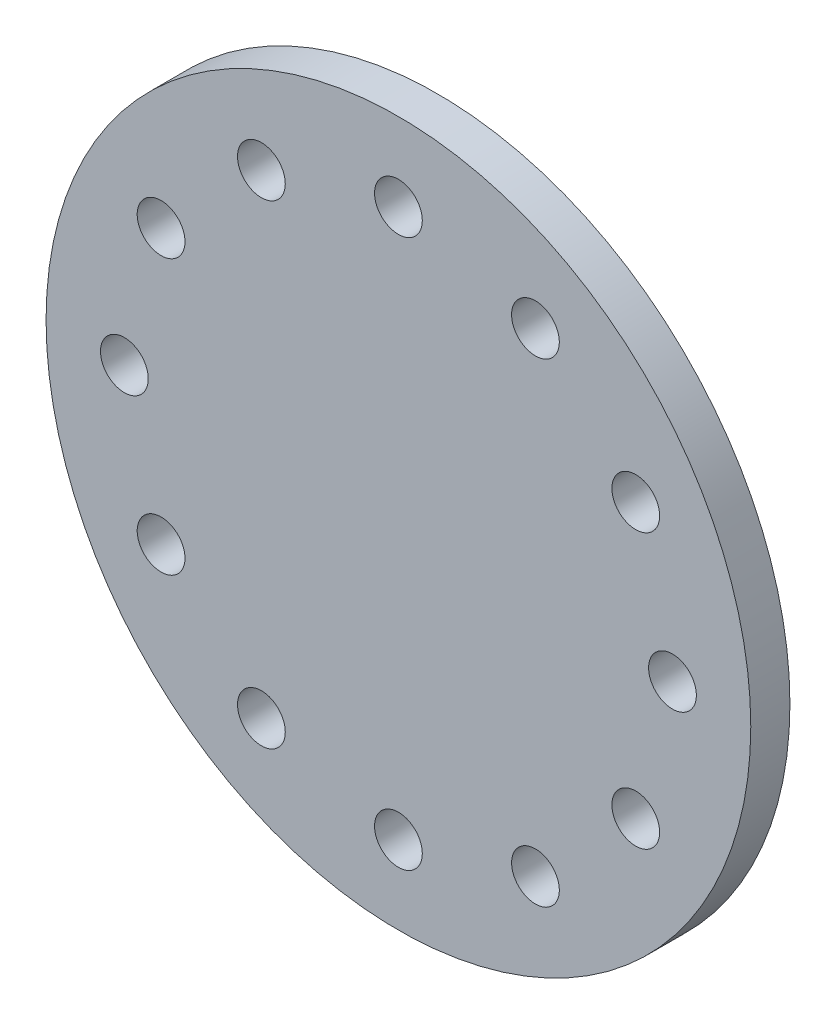
ISO-10303-21;
HEADER;
FILE_DESCRIPTION(('STEP AP214'),'2;1');
FILE_NAME('part.step','',(''),(''),'','','');
FILE_SCHEMA(('AUTOMOTIVE_DESIGN { 1 0 10303 214 1 1 1 1 }'));
ENDSEC;
DATA;
#1=APPLICATION_CONTEXT('core data for automotive mechanical design processes');
#2=APPLICATION_PROTOCOL_DEFINITION('international standard','automotive_design',2000,#1);
#3=PRODUCT_CONTEXT('',#1,'mechanical');
#4=PRODUCT('Part','Part','',(#3));
#5=PRODUCT_RELATED_PRODUCT_CATEGORY('part','',(#4));
#6=PRODUCT_DEFINITION_FORMATION('','',#4);
#7=PRODUCT_DEFINITION_CONTEXT('part definition',#1,'design');
#8=PRODUCT_DEFINITION('design','',#6,#7);
#9=PRODUCT_DEFINITION_SHAPE('','',#8);
#10=(LENGTH_UNIT() NAMED_UNIT(*) SI_UNIT(.MILLI.,.METRE.));
#11=(NAMED_UNIT(*) PLANE_ANGLE_UNIT() SI_UNIT($,.RADIAN.));
#12=(NAMED_UNIT(*) SI_UNIT($,.STERADIAN.) SOLID_ANGLE_UNIT());
#13=UNCERTAINTY_MEASURE_WITH_UNIT(LENGTH_MEASURE(1.E-05),#10,'distance_accuracy_value','');
#14=(GEOMETRIC_REPRESENTATION_CONTEXT(3) GLOBAL_UNCERTAINTY_ASSIGNED_CONTEXT((#13)) GLOBAL_UNIT_ASSIGNED_CONTEXT((#10,
#11,#12)) REPRESENTATION_CONTEXT('',''));
#15=CARTESIAN_POINT('',(0.,0.,0.));
#16=DIRECTION('',(0.,0.,1.));
#17=DIRECTION('',(1.,0.,0.));
#18=AXIS2_PLACEMENT_3D('',#15,#16,#17);
#19=CARTESIAN_POINT('',(0.,0.,5.));
#20=DIRECTION('',(0.,0.,-1.));
#21=DIRECTION('',(-1.,0.,0.));
#22=AXIS2_PLACEMENT_3D('',#19,#20,#21);
#23=CYLINDRICAL_SURFACE('',#22,45.);
#24=CARTESIAN_POINT('',(0.,0.,5.));
#25=DIRECTION('',(0.,0.,1.));
#26=DIRECTION('',(1.,0.,0.));
#27=AXIS2_PLACEMENT_3D('',#24,#25,#26);
#28=CIRCLE('',#27,45.);
#29=CARTESIAN_POINT('',(45.,0.,5.));
#30=VERTEX_POINT('',#29);
#31=EDGE_CURVE('E10',#30,#30,#28,.T.);
#32=ORIENTED_EDGE('',*,*,#31,.F.);
#33=EDGE_LOOP('',(#32));
#34=FACE_BOUND('',#33,.T.);
#35=CARTESIAN_POINT('',(0.,0.,0.));
#36=DIRECTION('',(0.,0.,1.));
#37=DIRECTION('',(1.,0.,0.));
#38=AXIS2_PLACEMENT_3D('',#35,#36,#37);
#39=CIRCLE('',#38,45.);
#40=CARTESIAN_POINT('',(45.,0.,0.));
#41=VERTEX_POINT('',#40);
#42=EDGE_CURVE('E36',#41,#41,#39,.T.);
#43=ORIENTED_EDGE('',*,*,#42,.T.);
#44=EDGE_LOOP('',(#43));
#45=FACE_BOUND('',#44,.T.);
#46=ADVANCED_FACE('F33',(#34,#45),#23,.T.);
#47=CARTESIAN_POINT('',(0.,0.,5.));
#48=DIRECTION('',(0.,0.,1.));
#49=DIRECTION('',(1.,0.,0.));
#50=AXIS2_PLACEMENT_3D('',#47,#48,#49);
#51=PLANE('',#50);
#52=CARTESIAN_POINT('',(-35.,0.,5.));
#53=DIRECTION('',(0.,0.,1.));
#54=DIRECTION('',(1.,0.,0.));
#55=AXIS2_PLACEMENT_3D('',#52,#53,#54);
#56=CIRCLE('',#55,3.04999999999999);
#57=CARTESIAN_POINT('',(-31.95,0.,5.));
#58=VERTEX_POINT('',#57);
#59=EDGE_CURVE('E113',#58,#58,#56,.T.);
#60=ORIENTED_EDGE('',*,*,#59,.F.);
#61=EDGE_LOOP('',(#60));
#62=FACE_BOUND('',#61,.T.);
#63=CARTESIAN_POINT('',(-30.3108891324553,17.5,5.));
#64=DIRECTION('',(0.,0.,1.));
#65=DIRECTION('',(1.,0.,0.));
#66=AXIS2_PLACEMENT_3D('',#63,#64,#65);
#67=CIRCLE('',#66,3.04999999999999);
#68=CARTESIAN_POINT('',(-27.2608891324554,17.5,5.));
#69=VERTEX_POINT('',#68);
#70=EDGE_CURVE('E107',#69,#69,#67,.T.);
#71=ORIENTED_EDGE('',*,*,#70,.F.);
#72=EDGE_LOOP('',(#71));
#73=FACE_BOUND('',#72,.T.);
#74=CARTESIAN_POINT('',(-17.4999999999999,30.3108891324554,5.));
#75=DIRECTION('',(0.,0.,1.));
#76=DIRECTION('',(1.,0.,0.));
#77=AXIS2_PLACEMENT_3D('',#74,#75,#76);
#78=CIRCLE('',#77,3.04999999999999);
#79=CARTESIAN_POINT('',(-14.45,30.3108891324554,5.));
#80=VERTEX_POINT('',#79);
#81=EDGE_CURVE('E101',#80,#80,#78,.T.);
#82=ORIENTED_EDGE('',*,*,#81,.F.);
#83=EDGE_LOOP('',(#82));
#84=FACE_BOUND('',#83,.T.);
#85=CARTESIAN_POINT('',(1.2220184685951E-13,35.,5.));
#86=DIRECTION('',(0.,0.,1.));
#87=DIRECTION('',(1.,0.,0.));
#88=AXIS2_PLACEMENT_3D('',#85,#86,#87);
#89=CIRCLE('',#88,3.04999999999999);
#90=CARTESIAN_POINT('',(3.05000000000011,35.,5.));
#91=VERTEX_POINT('',#90);
#92=EDGE_CURVE('E95',#91,#91,#89,.T.);
#93=ORIENTED_EDGE('',*,*,#92,.F.);
#94=EDGE_LOOP('',(#93));
#95=FACE_BOUND('',#94,.T.);
#96=CARTESIAN_POINT('',(17.5000000000001,30.3108891324553,5.));
#97=DIRECTION('',(0.,0.,1.));
#98=DIRECTION('',(1.,0.,0.));
#99=AXIS2_PLACEMENT_3D('',#96,#97,#98);
#100=CIRCLE('',#99,3.04999999999999);
#101=CARTESIAN_POINT('',(20.5500000000001,30.3108891324553,5.));
#102=VERTEX_POINT('',#101);
#103=EDGE_CURVE('E89',#102,#102,#100,.T.);
#104=ORIENTED_EDGE('',*,*,#103,.F.);
#105=EDGE_LOOP('',(#104));
#106=FACE_BOUND('',#105,.T.);
#107=CARTESIAN_POINT('',(30.3108891324555,17.4999999999998,5.));
#108=DIRECTION('',(0.,0.,1.));
#109=DIRECTION('',(1.,0.,0.));
#110=AXIS2_PLACEMENT_3D('',#107,#108,#109);
#111=CIRCLE('',#110,3.04999999999999);
#112=CARTESIAN_POINT('',(33.3608891324555,17.4999999999998,5.));
#113=VERTEX_POINT('',#112);
#114=EDGE_CURVE('E83',#113,#113,#111,.T.);
#115=ORIENTED_EDGE('',*,*,#114,.F.);
#116=EDGE_LOOP('',(#115));
#117=FACE_BOUND('',#116,.T.);
#118=CARTESIAN_POINT('',(35.,-2.44403693719019E-13,5.));
#119=DIRECTION('',(0.,0.,1.));
#120=DIRECTION('',(1.,0.,0.));
#121=AXIS2_PLACEMENT_3D('',#118,#119,#120);
#122=CIRCLE('',#121,3.04999999999999);
#123=CARTESIAN_POINT('',(38.05,-2.44403693719019E-13,5.));
#124=VERTEX_POINT('',#123);
#125=EDGE_CURVE('E77',#124,#124,#122,.T.);
#126=ORIENTED_EDGE('',*,*,#125,.F.);
#127=EDGE_LOOP('',(#126));
#128=FACE_BOUND('',#127,.T.);
#129=CARTESIAN_POINT('',(30.3108891324552,-17.5000000000003,5.));
#130=DIRECTION('',(0.,0.,1.));
#131=DIRECTION('',(1.,0.,0.));
#132=AXIS2_PLACEMENT_3D('',#129,#130,#131);
#133=CIRCLE('',#132,3.04999999999999);
#134=CARTESIAN_POINT('',(33.3608891324552,-17.5000000000003,5.));
#135=VERTEX_POINT('',#134);
#136=EDGE_CURVE('E71',#135,#135,#133,.T.);
#137=ORIENTED_EDGE('',*,*,#136,.F.);
#138=EDGE_LOOP('',(#137));
#139=FACE_BOUND('',#138,.T.);
#140=CARTESIAN_POINT('',(17.4999999999997,-30.3108891324555,5.));
#141=DIRECTION('',(0.,0.,1.));
#142=DIRECTION('',(1.,0.,0.));
#143=AXIS2_PLACEMENT_3D('',#140,#141,#142);
#144=CIRCLE('',#143,3.04999999999999);
#145=CARTESIAN_POINT('',(20.5499999999997,-30.3108891324555,5.));
#146=VERTEX_POINT('',#145);
#147=EDGE_CURVE('E65',#146,#146,#144,.T.);
#148=ORIENTED_EDGE('',*,*,#147,.F.);
#149=EDGE_LOOP('',(#148));
#150=FACE_BOUND('',#149,.T.);
#151=CARTESIAN_POINT('',(-3.66605540578529E-13,-35.,5.));
#152=DIRECTION('',(0.,0.,1.));
#153=DIRECTION('',(1.,0.,0.));
#154=AXIS2_PLACEMENT_3D('',#151,#152,#153);
#155=CIRCLE('',#154,3.04999999999999);
#156=CARTESIAN_POINT('',(3.04999999999962,-35.,5.));
#157=VERTEX_POINT('',#156);
#158=EDGE_CURVE('E59',#157,#157,#155,.T.);
#159=ORIENTED_EDGE('',*,*,#158,.F.);
#160=EDGE_LOOP('',(#159));
#161=FACE_BOUND('',#160,.T.);
#162=CARTESIAN_POINT('',(-17.5000000000004,-30.3108891324552,5.));
#163=DIRECTION('',(0.,0.,1.));
#164=DIRECTION('',(1.,0.,0.));
#165=AXIS2_PLACEMENT_3D('',#162,#163,#164);
#166=CIRCLE('',#165,3.04999999999999);
#167=CARTESIAN_POINT('',(-14.4500000000004,-30.3108891324552,5.));
#168=VERTEX_POINT('',#167);
#169=EDGE_CURVE('E53',#168,#168,#166,.T.);
#170=ORIENTED_EDGE('',*,*,#169,.F.);
#171=EDGE_LOOP('',(#170));
#172=FACE_BOUND('',#171,.T.);
#173=CARTESIAN_POINT('',(-30.3108891324556,-17.4999999999996,5.));
#174=DIRECTION('',(0.,0.,1.));
#175=DIRECTION('',(1.,0.,0.));
#176=AXIS2_PLACEMENT_3D('',#173,#174,#175);
#177=CIRCLE('',#176,3.04999999999999);
#178=CARTESIAN_POINT('',(-27.2608891324556,-17.4999999999996,5.));
#179=VERTEX_POINT('',#178);
#180=EDGE_CURVE('E47',#179,#179,#177,.T.);
#181=ORIENTED_EDGE('',*,*,#180,.F.);
#182=EDGE_LOOP('',(#181));
#183=FACE_BOUND('',#182,.T.);
#184=ORIENTED_EDGE('',*,*,#31,.T.);
#185=EDGE_LOOP('',(#184));
#186=FACE_BOUND('',#185,.T.);
#187=ADVANCED_FACE('F120',(#62,#73,#84,#95,#106,#117,#128,#139,#150,#161,#172,#183,#186),#51,.T.);
#188=CARTESIAN_POINT('',(0.,0.,0.));
#189=DIRECTION('',(0.,0.,1.));
#190=DIRECTION('',(1.,0.,0.));
#191=AXIS2_PLACEMENT_3D('',#188,#189,#190);
#192=PLANE('',#191);
#193=CARTESIAN_POINT('',(-35.,0.,0.));
#194=DIRECTION('',(0.,0.,1.));
#195=DIRECTION('',(1.,0.,0.));
#196=AXIS2_PLACEMENT_3D('',#193,#194,#195);
#197=CIRCLE('',#196,3.04999999999999);
#198=CARTESIAN_POINT('',(-31.95,0.,0.));
#199=VERTEX_POINT('',#198);
#200=EDGE_CURVE('E110',#199,#199,#197,.T.);
#201=ORIENTED_EDGE('',*,*,#200,.T.);
#202=EDGE_LOOP('',(#201));
#203=FACE_BOUND('',#202,.T.);
#204=CARTESIAN_POINT('',(-30.3108891324553,17.5,0.));
#205=DIRECTION('',(0.,0.,1.));
#206=DIRECTION('',(1.,0.,0.));
#207=AXIS2_PLACEMENT_3D('',#204,#205,#206);
#208=CIRCLE('',#207,3.04999999999999);
#209=CARTESIAN_POINT('',(-27.2608891324554,17.5,0.));
#210=VERTEX_POINT('',#209);
#211=EDGE_CURVE('E104',#210,#210,#208,.T.);
#212=ORIENTED_EDGE('',*,*,#211,.T.);
#213=EDGE_LOOP('',(#212));
#214=FACE_BOUND('',#213,.T.);
#215=CARTESIAN_POINT('',(-17.4999999999999,30.3108891324554,0.));
#216=DIRECTION('',(0.,0.,1.));
#217=DIRECTION('',(1.,0.,0.));
#218=AXIS2_PLACEMENT_3D('',#215,#216,#217);
#219=CIRCLE('',#218,3.04999999999999);
#220=CARTESIAN_POINT('',(-14.45,30.3108891324554,0.));
#221=VERTEX_POINT('',#220);
#222=EDGE_CURVE('E98',#221,#221,#219,.T.);
#223=ORIENTED_EDGE('',*,*,#222,.T.);
#224=EDGE_LOOP('',(#223));
#225=FACE_BOUND('',#224,.T.);
#226=CARTESIAN_POINT('',(1.2220184685951E-13,35.,0.));
#227=DIRECTION('',(0.,0.,1.));
#228=DIRECTION('',(1.,0.,0.));
#229=AXIS2_PLACEMENT_3D('',#226,#227,#228);
#230=CIRCLE('',#229,3.04999999999999);
#231=CARTESIAN_POINT('',(3.05000000000011,35.,0.));
#232=VERTEX_POINT('',#231);
#233=EDGE_CURVE('E92',#232,#232,#230,.T.);
#234=ORIENTED_EDGE('',*,*,#233,.T.);
#235=EDGE_LOOP('',(#234));
#236=FACE_BOUND('',#235,.T.);
#237=CARTESIAN_POINT('',(17.5000000000001,30.3108891324553,0.));
#238=DIRECTION('',(0.,0.,1.));
#239=DIRECTION('',(1.,0.,0.));
#240=AXIS2_PLACEMENT_3D('',#237,#238,#239);
#241=CIRCLE('',#240,3.04999999999999);
#242=CARTESIAN_POINT('',(20.5500000000001,30.3108891324553,0.));
#243=VERTEX_POINT('',#242);
#244=EDGE_CURVE('E86',#243,#243,#241,.T.);
#245=ORIENTED_EDGE('',*,*,#244,.T.);
#246=EDGE_LOOP('',(#245));
#247=FACE_BOUND('',#246,.T.);
#248=CARTESIAN_POINT('',(30.3108891324555,17.4999999999998,0.));
#249=DIRECTION('',(0.,0.,1.));
#250=DIRECTION('',(1.,0.,0.));
#251=AXIS2_PLACEMENT_3D('',#248,#249,#250);
#252=CIRCLE('',#251,3.04999999999999);
#253=CARTESIAN_POINT('',(33.3608891324555,17.4999999999998,0.));
#254=VERTEX_POINT('',#253);
#255=EDGE_CURVE('E80',#254,#254,#252,.T.);
#256=ORIENTED_EDGE('',*,*,#255,.T.);
#257=EDGE_LOOP('',(#256));
#258=FACE_BOUND('',#257,.T.);
#259=CARTESIAN_POINT('',(35.,-2.44403693719019E-13,0.));
#260=DIRECTION('',(0.,0.,1.));
#261=DIRECTION('',(1.,0.,0.));
#262=AXIS2_PLACEMENT_3D('',#259,#260,#261);
#263=CIRCLE('',#262,3.04999999999999);
#264=CARTESIAN_POINT('',(38.05,-2.44403693719019E-13,0.));
#265=VERTEX_POINT('',#264);
#266=EDGE_CURVE('E74',#265,#265,#263,.T.);
#267=ORIENTED_EDGE('',*,*,#266,.T.);
#268=EDGE_LOOP('',(#267));
#269=FACE_BOUND('',#268,.T.);
#270=CARTESIAN_POINT('',(30.3108891324552,-17.5000000000003,0.));
#271=DIRECTION('',(0.,0.,1.));
#272=DIRECTION('',(1.,0.,0.));
#273=AXIS2_PLACEMENT_3D('',#270,#271,#272);
#274=CIRCLE('',#273,3.04999999999999);
#275=CARTESIAN_POINT('',(33.3608891324552,-17.5000000000003,0.));
#276=VERTEX_POINT('',#275);
#277=EDGE_CURVE('E68',#276,#276,#274,.T.);
#278=ORIENTED_EDGE('',*,*,#277,.T.);
#279=EDGE_LOOP('',(#278));
#280=FACE_BOUND('',#279,.T.);
#281=CARTESIAN_POINT('',(17.4999999999997,-30.3108891324555,0.));
#282=DIRECTION('',(0.,0.,1.));
#283=DIRECTION('',(1.,0.,0.));
#284=AXIS2_PLACEMENT_3D('',#281,#282,#283);
#285=CIRCLE('',#284,3.04999999999999);
#286=CARTESIAN_POINT('',(20.5499999999997,-30.3108891324555,0.));
#287=VERTEX_POINT('',#286);
#288=EDGE_CURVE('E62',#287,#287,#285,.T.);
#289=ORIENTED_EDGE('',*,*,#288,.T.);
#290=EDGE_LOOP('',(#289));
#291=FACE_BOUND('',#290,.T.);
#292=CARTESIAN_POINT('',(-3.66605540578529E-13,-35.,0.));
#293=DIRECTION('',(0.,0.,1.));
#294=DIRECTION('',(1.,0.,0.));
#295=AXIS2_PLACEMENT_3D('',#292,#293,#294);
#296=CIRCLE('',#295,3.04999999999999);
#297=CARTESIAN_POINT('',(3.04999999999962,-35.,0.));
#298=VERTEX_POINT('',#297);
#299=EDGE_CURVE('E56',#298,#298,#296,.T.);
#300=ORIENTED_EDGE('',*,*,#299,.T.);
#301=EDGE_LOOP('',(#300));
#302=FACE_BOUND('',#301,.T.);
#303=CARTESIAN_POINT('',(-17.5000000000004,-30.3108891324552,0.));
#304=DIRECTION('',(0.,0.,1.));
#305=DIRECTION('',(1.,0.,0.));
#306=AXIS2_PLACEMENT_3D('',#303,#304,#305);
#307=CIRCLE('',#306,3.04999999999999);
#308=CARTESIAN_POINT('',(-14.4500000000004,-30.3108891324552,0.));
#309=VERTEX_POINT('',#308);
#310=EDGE_CURVE('E50',#309,#309,#307,.T.);
#311=ORIENTED_EDGE('',*,*,#310,.T.);
#312=EDGE_LOOP('',(#311));
#313=FACE_BOUND('',#312,.T.);
#314=CARTESIAN_POINT('',(-30.3108891324556,-17.4999999999996,0.));
#315=DIRECTION('',(0.,0.,1.));
#316=DIRECTION('',(1.,0.,0.));
#317=AXIS2_PLACEMENT_3D('',#314,#315,#316);
#318=CIRCLE('',#317,3.04999999999999);
#319=CARTESIAN_POINT('',(-27.2608891324556,-17.4999999999996,0.));
#320=VERTEX_POINT('',#319);
#321=EDGE_CURVE('E43',#320,#320,#318,.T.);
#322=ORIENTED_EDGE('',*,*,#321,.T.);
#323=EDGE_LOOP('',(#322));
#324=FACE_BOUND('',#323,.T.);
#325=ORIENTED_EDGE('',*,*,#42,.F.);
#326=EDGE_LOOP('',(#325));
#327=FACE_BOUND('',#326,.T.);
#328=ADVANCED_FACE('F123',(#203,#214,#225,#236,#247,#258,#269,#280,#291,#302,#313,#324,#327),
#192,.F.);
#329=CARTESIAN_POINT('',(-30.3108891324556,-17.4999999999996,5.));
#330=DIRECTION('',(0.,0.,1.));
#331=DIRECTION('',(1.,0.,0.));
#332=AXIS2_PLACEMENT_3D('',#329,#330,#331);
#333=CYLINDRICAL_SURFACE('',#332,3.04999999999999);
#334=ORIENTED_EDGE('',*,*,#180,.T.);
#335=EDGE_LOOP('',(#334));
#336=FACE_BOUND('',#335,.T.);
#337=ORIENTED_EDGE('',*,*,#321,.F.);
#338=EDGE_LOOP('',(#337));
#339=FACE_BOUND('',#338,.T.);
#340=ADVANCED_FACE('F147',(#336,#339),#333,.F.);
#341=CARTESIAN_POINT('',(-17.5000000000004,-30.3108891324552,5.));
#342=DIRECTION('',(0.,0.,1.));
#343=DIRECTION('',(1.,0.,0.));
#344=AXIS2_PLACEMENT_3D('',#341,#342,#343);
#345=CYLINDRICAL_SURFACE('',#344,3.04999999999999);
#346=ORIENTED_EDGE('',*,*,#169,.T.);
#347=EDGE_LOOP('',(#346));
#348=FACE_BOUND('',#347,.T.);
#349=ORIENTED_EDGE('',*,*,#310,.F.);
#350=EDGE_LOOP('',(#349));
#351=FACE_BOUND('',#350,.T.);
#352=ADVANCED_FACE('F150',(#348,#351),#345,.F.);
#353=CARTESIAN_POINT('',(-3.66605540578529E-13,-35.,5.));
#354=DIRECTION('',(0.,0.,1.));
#355=DIRECTION('',(1.,0.,0.));
#356=AXIS2_PLACEMENT_3D('',#353,#354,#355);
#357=CYLINDRICAL_SURFACE('',#356,3.04999999999999);
#358=ORIENTED_EDGE('',*,*,#158,.T.);
#359=EDGE_LOOP('',(#358));
#360=FACE_BOUND('',#359,.T.);
#361=ORIENTED_EDGE('',*,*,#299,.F.);
#362=EDGE_LOOP('',(#361));
#363=FACE_BOUND('',#362,.T.);
#364=ADVANCED_FACE('F181',(#360,#363),#357,.F.);
#365=CARTESIAN_POINT('',(17.4999999999997,-30.3108891324555,5.));
#366=DIRECTION('',(0.,0.,1.));
#367=DIRECTION('',(1.,0.,0.));
#368=AXIS2_PLACEMENT_3D('',#365,#366,#367);
#369=CYLINDRICAL_SURFACE('',#368,3.04999999999999);
#370=ORIENTED_EDGE('',*,*,#147,.T.);
#371=EDGE_LOOP('',(#370));
#372=FACE_BOUND('',#371,.T.);
#373=ORIENTED_EDGE('',*,*,#288,.F.);
#374=EDGE_LOOP('',(#373));
#375=FACE_BOUND('',#374,.T.);
#376=ADVANCED_FACE('F189',(#372,#375),#369,.F.);
#377=CARTESIAN_POINT('',(30.3108891324552,-17.5000000000003,5.));
#378=DIRECTION('',(0.,0.,1.));
#379=DIRECTION('',(1.,0.,0.));
#380=AXIS2_PLACEMENT_3D('',#377,#378,#379);
#381=CYLINDRICAL_SURFACE('',#380,3.04999999999999);
#382=ORIENTED_EDGE('',*,*,#136,.T.);
#383=EDGE_LOOP('',(#382));
#384=FACE_BOUND('',#383,.T.);
#385=ORIENTED_EDGE('',*,*,#277,.F.);
#386=EDGE_LOOP('',(#385));
#387=FACE_BOUND('',#386,.T.);
#388=ADVANCED_FACE('F197',(#384,#387),#381,.F.);
#389=CARTESIAN_POINT('',(35.,-2.44403693719019E-13,5.));
#390=DIRECTION('',(0.,0.,1.));
#391=DIRECTION('',(1.,0.,0.));
#392=AXIS2_PLACEMENT_3D('',#389,#390,#391);
#393=CYLINDRICAL_SURFACE('',#392,3.04999999999999);
#394=ORIENTED_EDGE('',*,*,#125,.T.);
#395=EDGE_LOOP('',(#394));
#396=FACE_BOUND('',#395,.T.);
#397=ORIENTED_EDGE('',*,*,#266,.F.);
#398=EDGE_LOOP('',(#397));
#399=FACE_BOUND('',#398,.T.);
#400=ADVANCED_FACE('F205',(#396,#399),#393,.F.);
#401=CARTESIAN_POINT('',(30.3108891324555,17.4999999999998,5.));
#402=DIRECTION('',(0.,0.,1.));
#403=DIRECTION('',(1.,0.,0.));
#404=AXIS2_PLACEMENT_3D('',#401,#402,#403);
#405=CYLINDRICAL_SURFACE('',#404,3.04999999999999);
#406=ORIENTED_EDGE('',*,*,#114,.T.);
#407=EDGE_LOOP('',(#406));
#408=FACE_BOUND('',#407,.T.);
#409=ORIENTED_EDGE('',*,*,#255,.F.);
#410=EDGE_LOOP('',(#409));
#411=FACE_BOUND('',#410,.T.);
#412=ADVANCED_FACE('F213',(#408,#411),#405,.F.);
#413=CARTESIAN_POINT('',(17.5000000000001,30.3108891324553,5.));
#414=DIRECTION('',(0.,0.,1.));
#415=DIRECTION('',(1.,0.,0.));
#416=AXIS2_PLACEMENT_3D('',#413,#414,#415);
#417=CYLINDRICAL_SURFACE('',#416,3.04999999999999);
#418=ORIENTED_EDGE('',*,*,#103,.T.);
#419=EDGE_LOOP('',(#418));
#420=FACE_BOUND('',#419,.T.);
#421=ORIENTED_EDGE('',*,*,#244,.F.);
#422=EDGE_LOOP('',(#421));
#423=FACE_BOUND('',#422,.T.);
#424=ADVANCED_FACE('F221',(#420,#423),#417,.F.);
#425=CARTESIAN_POINT('',(1.2220184685951E-13,35.,5.));
#426=DIRECTION('',(0.,0.,1.));
#427=DIRECTION('',(1.,0.,0.));
#428=AXIS2_PLACEMENT_3D('',#425,#426,#427);
#429=CYLINDRICAL_SURFACE('',#428,3.04999999999999);
#430=ORIENTED_EDGE('',*,*,#92,.T.);
#431=EDGE_LOOP('',(#430));
#432=FACE_BOUND('',#431,.T.);
#433=ORIENTED_EDGE('',*,*,#233,.F.);
#434=EDGE_LOOP('',(#433));
#435=FACE_BOUND('',#434,.T.);
#436=ADVANCED_FACE('F229',(#432,#435),#429,.F.);
#437=CARTESIAN_POINT('',(-17.4999999999999,30.3108891324554,5.));
#438=DIRECTION('',(0.,0.,1.));
#439=DIRECTION('',(1.,0.,0.));
#440=AXIS2_PLACEMENT_3D('',#437,#438,#439);
#441=CYLINDRICAL_SURFACE('',#440,3.04999999999999);
#442=ORIENTED_EDGE('',*,*,#81,.T.);
#443=EDGE_LOOP('',(#442));
#444=FACE_BOUND('',#443,.T.);
#445=ORIENTED_EDGE('',*,*,#222,.F.);
#446=EDGE_LOOP('',(#445));
#447=FACE_BOUND('',#446,.T.);
#448=ADVANCED_FACE('F237',(#444,#447),#441,.F.);
#449=CARTESIAN_POINT('',(-30.3108891324553,17.5,5.));
#450=DIRECTION('',(0.,0.,1.));
#451=DIRECTION('',(1.,0.,0.));
#452=AXIS2_PLACEMENT_3D('',#449,#450,#451);
#453=CYLINDRICAL_SURFACE('',#452,3.04999999999999);
#454=ORIENTED_EDGE('',*,*,#70,.T.);
#455=EDGE_LOOP('',(#454));
#456=FACE_BOUND('',#455,.T.);
#457=ORIENTED_EDGE('',*,*,#211,.F.);
#458=EDGE_LOOP('',(#457));
#459=FACE_BOUND('',#458,.T.);
#460=ADVANCED_FACE('F245',(#456,#459),#453,.F.);
#461=CARTESIAN_POINT('',(-35.,0.,5.));
#462=DIRECTION('',(0.,0.,1.));
#463=DIRECTION('',(1.,0.,0.));
#464=AXIS2_PLACEMENT_3D('',#461,#462,#463);
#465=CYLINDRICAL_SURFACE('',#464,3.04999999999999);
#466=ORIENTED_EDGE('',*,*,#59,.T.);
#467=EDGE_LOOP('',(#466));
#468=FACE_BOUND('',#467,.T.);
#469=ORIENTED_EDGE('',*,*,#200,.F.);
#470=EDGE_LOOP('',(#469));
#471=FACE_BOUND('',#470,.T.);
#472=ADVANCED_FACE('F117',(#468,#471),#465,.F.);
#473=CLOSED_SHELL('',(#46,#187,#328,#340,#352,#364,#376,#388,#400,#412,#424,#436,#448,#460,#472));
#474=MANIFOLD_SOLID_BREP('B2',#473);
#475=ADVANCED_BREP_SHAPE_REPRESENTATION('',(#18,#474),#14);
#476=SHAPE_DEFINITION_REPRESENTATION(#9,#475);
ENDSEC;
END-ISO-10303-21;
